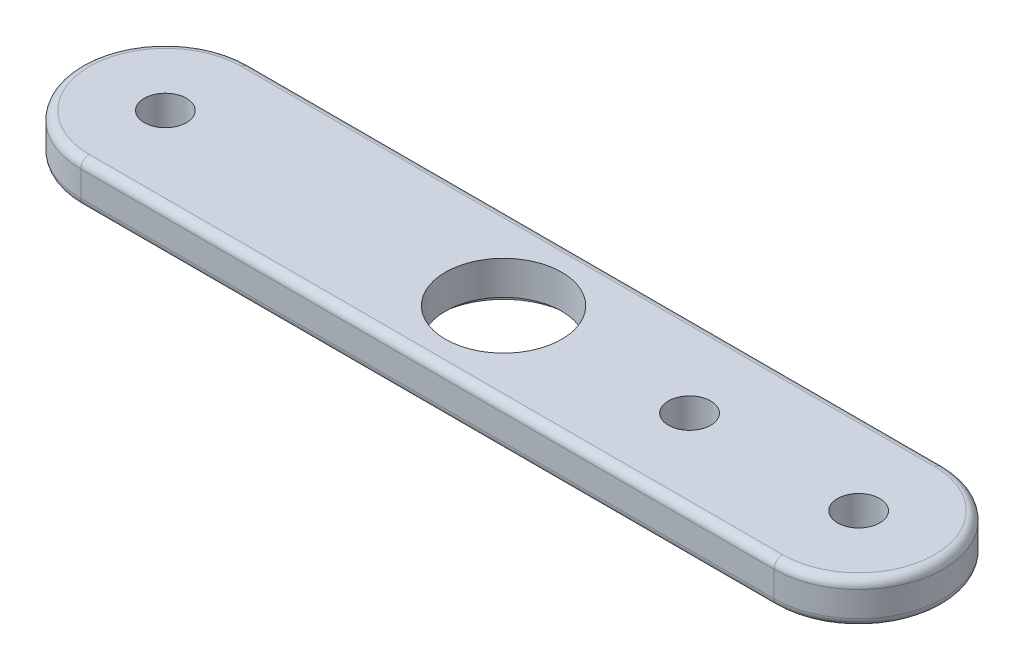
ISO-10303-21;
HEADER;
FILE_DESCRIPTION(('STEP AP214'),'2;1');
FILE_NAME('part.step','',(''),(''),'','','');
FILE_SCHEMA(('AUTOMOTIVE_DESIGN { 1 0 10303 214 1 1 1 1 }'));
ENDSEC;
DATA;
#1=APPLICATION_CONTEXT('core data for automotive mechanical design processes');
#2=APPLICATION_PROTOCOL_DEFINITION('international standard','automotive_design',2000,#1);
#3=PRODUCT_CONTEXT('',#1,'mechanical');
#4=PRODUCT('Part','Part','',(#3));
#5=PRODUCT_RELATED_PRODUCT_CATEGORY('part','',(#4));
#6=PRODUCT_DEFINITION_FORMATION('','',#4);
#7=PRODUCT_DEFINITION_CONTEXT('part definition',#1,'design');
#8=PRODUCT_DEFINITION('design','',#6,#7);
#9=PRODUCT_DEFINITION_SHAPE('','',#8);
#10=(LENGTH_UNIT() NAMED_UNIT(*) SI_UNIT(.MILLI.,.METRE.));
#11=(NAMED_UNIT(*) PLANE_ANGLE_UNIT() SI_UNIT($,.RADIAN.));
#12=(NAMED_UNIT(*) SI_UNIT($,.STERADIAN.) SOLID_ANGLE_UNIT());
#13=UNCERTAINTY_MEASURE_WITH_UNIT(LENGTH_MEASURE(1.E-05),#10,'distance_accuracy_value','');
#14=(GEOMETRIC_REPRESENTATION_CONTEXT(3) GLOBAL_UNCERTAINTY_ASSIGNED_CONTEXT((#13)) GLOBAL_UNIT_ASSIGNED_CONTEXT((#10,
#11,#12)) REPRESENTATION_CONTEXT('',''));
#15=CARTESIAN_POINT('',(0.,0.,0.));
#16=DIRECTION('',(0.,0.,1.));
#17=DIRECTION('',(1.,0.,0.));
#18=AXIS2_PLACEMENT_3D('',#15,#16,#17);
#19=CARTESIAN_POINT('',(0.,6.35,0.));
#20=DIRECTION('',(0.,1.,0.));
#21=DIRECTION('',(0.,0.,1.));
#22=AXIS2_PLACEMENT_3D('',#19,#20,#21);
#23=PLANE('',#22);
#24=CARTESIAN_POINT('',(52.07,6.35,0.));
#25=DIRECTION('',(0.,1.,0.));
#26=DIRECTION('',(0.,0.,1.));
#27=AXIS2_PLACEMENT_3D('',#24,#25,#26);
#28=CIRCLE('',#27,11.43);
#29=CARTESIAN_POINT('',(52.07,6.35,11.43));
#30=VERTEX_POINT('',#29);
#31=CARTESIAN_POINT('',(52.07,6.35,-11.43));
#32=VERTEX_POINT('',#31);
#33=EDGE_CURVE('E62',#30,#32,#28,.T.);
#34=ORIENTED_EDGE('',*,*,#33,.T.);
#35=DIRECTION('',(-1.,0.,0.));
#36=VECTOR('',#35,1.);
#37=CARTESIAN_POINT('',(-52.07,6.35,-11.43));
#38=LINE('',#37,#36);
#39=CARTESIAN_POINT('',(-52.07,6.35,-11.43));
#40=VERTEX_POINT('',#39);
#41=EDGE_CURVE('E57',#32,#40,#38,.T.);
#42=ORIENTED_EDGE('',*,*,#41,.T.);
#43=CARTESIAN_POINT('',(-52.07,6.35,0.));
#44=DIRECTION('',(0.,1.,0.));
#45=DIRECTION('',(0.,0.,1.));
#46=AXIS2_PLACEMENT_3D('',#43,#44,#45);
#47=CIRCLE('',#46,11.43);
#48=CARTESIAN_POINT('',(-52.07,6.35,11.43));
#49=VERTEX_POINT('',#48);
#50=EDGE_CURVE('E176',#40,#49,#47,.T.);
#51=ORIENTED_EDGE('',*,*,#50,.T.);
#52=DIRECTION('',(1.,0.,0.));
#53=VECTOR('',#52,1.);
#54=CARTESIAN_POINT('',(52.07,6.35,11.43));
#55=LINE('',#54,#53);
#56=EDGE_CURVE('E171',#49,#30,#55,.T.);
#57=ORIENTED_EDGE('',*,*,#56,.T.);
#58=EDGE_LOOP('',(#34,#42,#51,#57));
#59=FACE_BOUND('',#58,.T.);
#60=CARTESIAN_POINT('',(-52.07,6.35,0.));
#61=DIRECTION('',(0.,1.,0.));
#62=DIRECTION('',(0.,0.,1.));
#63=AXIS2_PLACEMENT_3D('',#60,#61,#62);
#64=CIRCLE('',#63,3.175);
#65=CARTESIAN_POINT('',(-52.07,6.35,3.175));
#66=VERTEX_POINT('',#65);
#67=EDGE_CURVE('E239',#66,#66,#64,.T.);
#68=ORIENTED_EDGE('',*,*,#67,.F.);
#69=EDGE_LOOP('',(#68));
#70=FACE_BOUND('',#69,.T.);
#71=CARTESIAN_POINT('',(26.67,6.35,0.));
#72=DIRECTION('',(0.,1.,0.));
#73=DIRECTION('',(0.,0.,1.));
#74=AXIS2_PLACEMENT_3D('',#71,#72,#73);
#75=CIRCLE('',#74,3.175);
#76=CARTESIAN_POINT('',(26.67,6.35,3.175));
#77=VERTEX_POINT('',#76);
#78=EDGE_CURVE('E247',#77,#77,#75,.T.);
#79=ORIENTED_EDGE('',*,*,#78,.F.);
#80=EDGE_LOOP('',(#79));
#81=FACE_BOUND('',#80,.T.);
#82=CARTESIAN_POINT('',(52.07,6.35,0.));
#83=DIRECTION('',(0.,1.,0.));
#84=DIRECTION('',(0.,0.,1.));
#85=AXIS2_PLACEMENT_3D('',#82,#83,#84);
#86=CIRCLE('',#85,3.17500000000001);
#87=CARTESIAN_POINT('',(52.07,6.35,3.17500000000001));
#88=VERTEX_POINT('',#87);
#89=EDGE_CURVE('E255',#88,#88,#86,.T.);
#90=ORIENTED_EDGE('',*,*,#89,.F.);
#91=EDGE_LOOP('',(#90));
#92=FACE_BOUND('',#91,.T.);
#93=CARTESIAN_POINT('',(-1.26999999999999,6.35,0.));
#94=DIRECTION('',(0.,1.,0.));
#95=DIRECTION('',(0.,0.,1.));
#96=AXIS2_PLACEMENT_3D('',#93,#94,#95);
#97=CIRCLE('',#96,8.73125);
#98=CARTESIAN_POINT('',(-1.26999999999999,6.35,8.73125));
#99=VERTEX_POINT('',#98);
#100=EDGE_CURVE('E259',#99,#99,#97,.T.);
#101=ORIENTED_EDGE('',*,*,#100,.F.);
#102=EDGE_LOOP('',(#101));
#103=FACE_BOUND('',#102,.T.);
#104=ADVANCED_FACE('F39',(#59,#70,#81,#92,#103),#23,.T.);
#105=CARTESIAN_POINT('',(0.,0.,0.));
#106=DIRECTION('',(0.,1.,0.));
#107=DIRECTION('',(0.,0.,1.));
#108=AXIS2_PLACEMENT_3D('',#105,#106,#107);
#109=PLANE('',#108);
#110=CARTESIAN_POINT('',(-52.07,0.,0.));
#111=DIRECTION('',(0.,1.,0.));
#112=DIRECTION('',(0.,0.,1.));
#113=AXIS2_PLACEMENT_3D('',#110,#111,#112);
#114=CIRCLE('',#113,11.43);
#115=CARTESIAN_POINT('',(-52.07,0.,11.43));
#116=VERTEX_POINT('',#115);
#117=CARTESIAN_POINT('',(-52.07,0.,-11.43));
#118=VERTEX_POINT('',#117);
#119=EDGE_CURVE('E160',#116,#118,#114,.F.);
#120=ORIENTED_EDGE('',*,*,#119,.T.);
#121=DIRECTION('',(-1.,0.,0.));
#122=VECTOR('',#121,1.);
#123=CARTESIAN_POINT('',(0.,0.,-11.43));
#124=LINE('',#123,#122);
#125=CARTESIAN_POINT('',(52.07,0.,-11.43));
#126=VERTEX_POINT('',#125);
#127=EDGE_CURVE('E136',#118,#126,#124,.F.);
#128=ORIENTED_EDGE('',*,*,#127,.T.);
#129=CARTESIAN_POINT('',(52.07,0.,0.));
#130=DIRECTION('',(0.,1.,0.));
#131=DIRECTION('',(0.,0.,1.));
#132=AXIS2_PLACEMENT_3D('',#129,#130,#131);
#133=CIRCLE('',#132,11.43);
#134=CARTESIAN_POINT('',(52.07,0.,11.43));
#135=VERTEX_POINT('',#134);
#136=EDGE_CURVE('E152',#126,#135,#133,.F.);
#137=ORIENTED_EDGE('',*,*,#136,.T.);
#138=DIRECTION('',(1.,0.,0.));
#139=VECTOR('',#138,1.);
#140=CARTESIAN_POINT('',(0.,0.,11.43));
#141=LINE('',#140,#139);
#142=EDGE_CURVE('E148',#135,#116,#141,.F.);
#143=ORIENTED_EDGE('',*,*,#142,.T.);
#144=EDGE_LOOP('',(#120,#128,#137,#143));
#145=FACE_BOUND('',#144,.T.);
#146=CARTESIAN_POINT('',(-1.26999999999999,0.,0.));
#147=DIRECTION('',(0.,-1.,0.));
#148=DIRECTION('',(0.,0.,-1.));
#149=AXIS2_PLACEMENT_3D('',#146,#147,#148);
#150=CIRCLE('',#149,10.16);
#151=CARTESIAN_POINT('',(-1.26999999999999,0.,-10.16));
#152=VERTEX_POINT('',#151);
#153=EDGE_CURVE('E131',#152,#152,#150,.T.);
#154=ORIENTED_EDGE('',*,*,#153,.F.);
#155=EDGE_LOOP('',(#154));
#156=FACE_BOUND('',#155,.T.);
#157=CARTESIAN_POINT('',(-52.07,0.,0.));
#158=DIRECTION('',(0.,1.,0.));
#159=DIRECTION('',(0.,0.,1.));
#160=AXIS2_PLACEMENT_3D('',#157,#158,#159);
#161=CIRCLE('',#160,3.175);
#162=CARTESIAN_POINT('',(-52.07,0.,3.175));
#163=VERTEX_POINT('',#162);
#164=EDGE_CURVE('E154',#163,#163,#161,.T.);
#165=ORIENTED_EDGE('',*,*,#164,.T.);
#166=EDGE_LOOP('',(#165));
#167=FACE_BOUND('',#166,.T.);
#168=CARTESIAN_POINT('',(26.67,0.,0.));
#169=DIRECTION('',(0.,1.,0.));
#170=DIRECTION('',(0.,0.,1.));
#171=AXIS2_PLACEMENT_3D('',#168,#169,#170);
#172=CIRCLE('',#171,3.175);
#173=CARTESIAN_POINT('',(26.67,0.,3.175));
#174=VERTEX_POINT('',#173);
#175=EDGE_CURVE('E243',#174,#174,#172,.T.);
#176=ORIENTED_EDGE('',*,*,#175,.T.);
#177=EDGE_LOOP('',(#176));
#178=FACE_BOUND('',#177,.T.);
#179=CARTESIAN_POINT('',(52.07,0.,0.));
#180=DIRECTION('',(0.,1.,0.));
#181=DIRECTION('',(0.,0.,1.));
#182=AXIS2_PLACEMENT_3D('',#179,#180,#181);
#183=CIRCLE('',#182,3.17500000000001);
#184=CARTESIAN_POINT('',(52.07,0.,3.17500000000001));
#185=VERTEX_POINT('',#184);
#186=EDGE_CURVE('E251',#185,#185,#183,.T.);
#187=ORIENTED_EDGE('',*,*,#186,.T.);
#188=EDGE_LOOP('',(#187));
#189=FACE_BOUND('',#188,.T.);
#190=ADVANCED_FACE('F283',(#145,#156,#167,#178,#189),#109,.F.);
#191=CARTESIAN_POINT('',(64.77,6.35,12.7));
#192=DIRECTION('',(0.,0.,-1.));
#193=DIRECTION('',(-1.,0.,0.));
#194=AXIS2_PLACEMENT_3D('',#191,#192,#193);
#195=PLANE('',#194);
#196=DIRECTION('',(0.,1.,0.));
#197=VECTOR('',#196,1.);
#198=CARTESIAN_POINT('',(-52.07,0.,12.7));
#199=LINE('',#198,#197);
#200=CARTESIAN_POINT('',(-52.07,1.27,12.7));
#201=VERTEX_POINT('',#200);
#202=CARTESIAN_POINT('',(-52.07,5.08,12.7));
#203=VERTEX_POINT('',#202);
#204=EDGE_CURVE('E221',#201,#203,#199,.T.);
#205=ORIENTED_EDGE('',*,*,#204,.F.);
#206=DIRECTION('',(1.,0.,0.));
#207=VECTOR('',#206,1.);
#208=CARTESIAN_POINT('',(64.77,1.27,12.7));
#209=LINE('',#208,#207);
#210=CARTESIAN_POINT('',(52.07,1.27,12.7));
#211=VERTEX_POINT('',#210);
#212=EDGE_CURVE('E11',#201,#211,#209,.T.);
#213=ORIENTED_EDGE('',*,*,#212,.T.);
#214=DIRECTION('',(0.,1.,0.));
#215=VECTOR('',#214,1.);
#216=CARTESIAN_POINT('',(52.07,0.,12.7));
#217=LINE('',#216,#215);
#218=CARTESIAN_POINT('',(52.07,5.08,12.7));
#219=VERTEX_POINT('',#218);
#220=EDGE_CURVE('E193',#211,#219,#217,.T.);
#221=ORIENTED_EDGE('',*,*,#220,.T.);
#222=DIRECTION('',(1.,0.,0.));
#223=VECTOR('',#222,1.);
#224=CARTESIAN_POINT('',(-52.07,5.08,12.7));
#225=LINE('',#224,#223);
#226=EDGE_CURVE('E49',#219,#203,#225,.F.);
#227=ORIENTED_EDGE('',*,*,#226,.T.);
#228=EDGE_LOOP('',(#205,#213,#221,#227));
#229=FACE_BOUND('',#228,.T.);
#230=ADVANCED_FACE('F219',(#229),#195,.F.);
#231=CARTESIAN_POINT('',(64.77,6.35,-12.7));
#232=DIRECTION('',(0.,0.,1.));
#233=DIRECTION('',(1.,0.,0.));
#234=AXIS2_PLACEMENT_3D('',#231,#232,#233);
#235=PLANE('',#234);
#236=DIRECTION('',(0.,1.,0.));
#237=VECTOR('',#236,1.);
#238=CARTESIAN_POINT('',(52.07,0.,-12.7));
#239=LINE('',#238,#237);
#240=CARTESIAN_POINT('',(52.07,1.27,-12.7));
#241=VERTEX_POINT('',#240);
#242=CARTESIAN_POINT('',(52.07,5.08,-12.7));
#243=VERTEX_POINT('',#242);
#244=EDGE_CURVE('E112',#241,#243,#239,.T.);
#245=ORIENTED_EDGE('',*,*,#244,.F.);
#246=DIRECTION('',(-1.,0.,0.));
#247=VECTOR('',#246,1.);
#248=CARTESIAN_POINT('',(64.77,1.27,-12.7));
#249=LINE('',#248,#247);
#250=CARTESIAN_POINT('',(-52.07,1.27,-12.7));
#251=VERTEX_POINT('',#250);
#252=EDGE_CURVE('E107',#241,#251,#249,.T.);
#253=ORIENTED_EDGE('',*,*,#252,.T.);
#254=DIRECTION('',(0.,1.,0.));
#255=VECTOR('',#254,1.);
#256=CARTESIAN_POINT('',(-52.07,0.,-12.7));
#257=LINE('',#256,#255);
#258=CARTESIAN_POINT('',(-52.07,5.08,-12.7));
#259=VERTEX_POINT('',#258);
#260=EDGE_CURVE('E110',#251,#259,#257,.T.);
#261=ORIENTED_EDGE('',*,*,#260,.T.);
#262=DIRECTION('',(-1.,0.,0.));
#263=VECTOR('',#262,1.);
#264=CARTESIAN_POINT('',(52.07,5.08,-12.7));
#265=LINE('',#264,#263);
#266=EDGE_CURVE('E118',#259,#243,#265,.F.);
#267=ORIENTED_EDGE('',*,*,#266,.T.);
#268=EDGE_LOOP('',(#245,#253,#261,#267));
#269=FACE_BOUND('',#268,.T.);
#270=ADVANCED_FACE('F109',(#269),#235,.F.);
#271=CARTESIAN_POINT('',(-1.26999999999999,0.,0.));
#272=DIRECTION('',(0.,1.,0.));
#273=DIRECTION('',(0.,0.,1.));
#274=AXIS2_PLACEMENT_3D('',#271,#272,#273);
#275=CYLINDRICAL_SURFACE('',#274,8.73125);
#276=ORIENTED_EDGE('',*,*,#100,.T.);
#277=EDGE_LOOP('',(#276));
#278=FACE_BOUND('',#277,.T.);
#279=CARTESIAN_POINT('',(-1.26999999999999,1.27,0.));
#280=DIRECTION('',(0.,-1.,0.));
#281=DIRECTION('',(0.,0.,-1.));
#282=AXIS2_PLACEMENT_3D('',#279,#280,#281);
#283=CIRCLE('',#282,8.73125);
#284=CARTESIAN_POINT('',(-1.26999999999999,1.27,-8.73125));
#285=VERTEX_POINT('',#284);
#286=EDGE_CURVE('E232',#285,#285,#283,.F.);
#287=ORIENTED_EDGE('',*,*,#286,.F.);
#288=EDGE_LOOP('',(#287));
#289=FACE_BOUND('',#288,.T.);
#290=ADVANCED_FACE('F268',(#278,#289),#275,.F.);
#291=CARTESIAN_POINT('',(52.07,0.,0.));
#292=DIRECTION('',(0.,1.,0.));
#293=DIRECTION('',(0.,0.,1.));
#294=AXIS2_PLACEMENT_3D('',#291,#292,#293);
#295=CYLINDRICAL_SURFACE('',#294,3.17500000000001);
#296=ORIENTED_EDGE('',*,*,#186,.F.);
#297=EDGE_LOOP('',(#296));
#298=FACE_BOUND('',#297,.T.);
#299=ORIENTED_EDGE('',*,*,#89,.T.);
#300=EDGE_LOOP('',(#299));
#301=FACE_BOUND('',#300,.T.);
#302=ADVANCED_FACE('F270',(#298,#301),#295,.F.);
#303=CARTESIAN_POINT('',(26.67,0.,0.));
#304=DIRECTION('',(0.,1.,0.));
#305=DIRECTION('',(0.,0.,1.));
#306=AXIS2_PLACEMENT_3D('',#303,#304,#305);
#307=CYLINDRICAL_SURFACE('',#306,3.175);
#308=ORIENTED_EDGE('',*,*,#175,.F.);
#309=EDGE_LOOP('',(#308));
#310=FACE_BOUND('',#309,.T.);
#311=ORIENTED_EDGE('',*,*,#78,.T.);
#312=EDGE_LOOP('',(#311));
#313=FACE_BOUND('',#312,.T.);
#314=ADVANCED_FACE('F277',(#310,#313),#307,.F.);
#315=CARTESIAN_POINT('',(-52.07,0.,0.));
#316=DIRECTION('',(0.,1.,0.));
#317=DIRECTION('',(0.,0.,1.));
#318=AXIS2_PLACEMENT_3D('',#315,#316,#317);
#319=CYLINDRICAL_SURFACE('',#318,3.175);
#320=ORIENTED_EDGE('',*,*,#164,.F.);
#321=EDGE_LOOP('',(#320));
#322=FACE_BOUND('',#321,.T.);
#323=ORIENTED_EDGE('',*,*,#67,.T.);
#324=EDGE_LOOP('',(#323));
#325=FACE_BOUND('',#324,.T.);
#326=ADVANCED_FACE('F360',(#322,#325),#319,.F.);
#327=CARTESIAN_POINT('',(-1.26999999999999,1.27,0.));
#328=DIRECTION('',(0.,-1.,0.));
#329=DIRECTION('',(0.,0.,-1.));
#330=AXIS2_PLACEMENT_3D('',#327,#328,#329);
#331=PLANE('',#330);
#332=CARTESIAN_POINT('',(-1.26999999999999,1.27,0.));
#333=DIRECTION('',(0.,-1.,0.));
#334=DIRECTION('',(0.,0.,-1.));
#335=AXIS2_PLACEMENT_3D('',#332,#333,#334);
#336=CIRCLE('',#335,10.16);
#337=CARTESIAN_POINT('',(-1.26999999999999,1.27,-10.16));
#338=VERTEX_POINT('',#337);
#339=EDGE_CURVE('E228',#338,#338,#336,.T.);
#340=ORIENTED_EDGE('',*,*,#339,.T.);
#341=EDGE_LOOP('',(#340));
#342=FACE_BOUND('',#341,.T.);
#343=ORIENTED_EDGE('',*,*,#286,.T.);
#344=EDGE_LOOP('',(#343));
#345=FACE_BOUND('',#344,.T.);
#346=ADVANCED_FACE('F266',(#342,#345),#331,.T.);
#347=CARTESIAN_POINT('',(-1.26999999999999,1.27,0.));
#348=DIRECTION('',(0.,-1.,0.));
#349=DIRECTION('',(0.,0.,-1.));
#350=AXIS2_PLACEMENT_3D('',#347,#348,#349);
#351=CYLINDRICAL_SURFACE('',#350,10.16);
#352=ORIENTED_EDGE('',*,*,#339,.F.);
#353=EDGE_LOOP('',(#352));
#354=FACE_BOUND('',#353,.T.);
#355=ORIENTED_EDGE('',*,*,#153,.T.);
#356=EDGE_LOOP('',(#355));
#357=FACE_BOUND('',#356,.T.);
#358=ADVANCED_FACE('F345',(#354,#357),#351,.F.);
#359=CARTESIAN_POINT('',(52.07,0.,0.));
#360=DIRECTION('',(0.,1.,0.));
#361=DIRECTION('',(0.,0.,1.));
#362=AXIS2_PLACEMENT_3D('',#359,#360,#361);
#363=CYLINDRICAL_SURFACE('',#362,12.7);
#364=ORIENTED_EDGE('',*,*,#220,.F.);
#365=CARTESIAN_POINT('',(52.07,1.27,0.));
#366=DIRECTION('',(0.,1.,0.));
#367=DIRECTION('',(0.,0.,1.));
#368=AXIS2_PLACEMENT_3D('',#365,#366,#367);
#369=CIRCLE('',#368,12.7);
#370=EDGE_CURVE('E168',#211,#241,#369,.T.);
#371=ORIENTED_EDGE('',*,*,#370,.T.);
#372=ORIENTED_EDGE('',*,*,#244,.T.);
#373=CARTESIAN_POINT('',(52.07,5.08,0.));
#374=DIRECTION('',(0.,1.,0.));
#375=DIRECTION('',(0.,0.,1.));
#376=AXIS2_PLACEMENT_3D('',#373,#374,#375);
#377=CIRCLE('',#376,12.7);
#378=EDGE_CURVE('E165',#243,#219,#377,.F.);
#379=ORIENTED_EDGE('',*,*,#378,.T.);
#380=EDGE_LOOP('',(#364,#371,#372,#379));
#381=FACE_BOUND('',#380,.T.);
#382=ADVANCED_FACE('F216',(#381),#363,.T.);
#383=CARTESIAN_POINT('',(-52.07,0.,0.));
#384=DIRECTION('',(0.,1.,0.));
#385=DIRECTION('',(0.,0.,1.));
#386=AXIS2_PLACEMENT_3D('',#383,#384,#385);
#387=CYLINDRICAL_SURFACE('',#386,12.7);
#388=ORIENTED_EDGE('',*,*,#260,.F.);
#389=CARTESIAN_POINT('',(-52.07,1.27,0.));
#390=DIRECTION('',(0.,1.,0.));
#391=DIRECTION('',(0.,0.,1.));
#392=AXIS2_PLACEMENT_3D('',#389,#390,#391);
#393=CIRCLE('',#392,12.7);
#394=EDGE_CURVE('E126',#251,#201,#393,.T.);
#395=ORIENTED_EDGE('',*,*,#394,.T.);
#396=ORIENTED_EDGE('',*,*,#204,.T.);
#397=CARTESIAN_POINT('',(-52.07,5.08,0.));
#398=DIRECTION('',(0.,1.,0.));
#399=DIRECTION('',(0.,0.,1.));
#400=AXIS2_PLACEMENT_3D('',#397,#398,#399);
#401=CIRCLE('',#400,12.7);
#402=EDGE_CURVE('E129',#203,#259,#401,.F.);
#403=ORIENTED_EDGE('',*,*,#402,.T.);
#404=EDGE_LOOP('',(#388,#395,#396,#403));
#405=FACE_BOUND('',#404,.T.);
#406=ADVANCED_FACE('F123',(#405),#387,.T.);
#407=CARTESIAN_POINT('',(52.07,1.27,0.));
#408=DIRECTION('',(0.,1.,0.));
#409=DIRECTION('',(0.,0.,1.));
#410=AXIS2_PLACEMENT_3D('',#407,#408,#409);
#411=TOROIDAL_SURFACE('',#410,11.43,1.27);
#412=CARTESIAN_POINT('',(52.07,1.27,11.43));
#413=DIRECTION('',(-1.,0.,0.));
#414=DIRECTION('',(0.,0.,1.));
#415=AXIS2_PLACEMENT_3D('',#412,#413,#414);
#416=CIRCLE('',#415,1.27);
#417=EDGE_CURVE('E141',#135,#211,#416,.T.);
#418=ORIENTED_EDGE('',*,*,#417,.F.);
#419=ORIENTED_EDGE('',*,*,#136,.F.);
#420=CARTESIAN_POINT('',(52.07,1.27,-11.43));
#421=DIRECTION('',(-1.,0.,0.));
#422=DIRECTION('',(0.,0.,1.));
#423=AXIS2_PLACEMENT_3D('',#420,#421,#422);
#424=CIRCLE('',#423,1.27);
#425=EDGE_CURVE('E190',#241,#126,#424,.T.);
#426=ORIENTED_EDGE('',*,*,#425,.F.);
#427=ORIENTED_EDGE('',*,*,#370,.F.);
#428=EDGE_LOOP('',(#418,#419,#426,#427));
#429=FACE_BOUND('',#428,.T.);
#430=ADVANCED_FACE('F301',(#429),#411,.T.);
#431=CARTESIAN_POINT('',(64.77,1.27,-11.43));
#432=DIRECTION('',(-1.,0.,0.));
#433=DIRECTION('',(0.,0.,1.));
#434=AXIS2_PLACEMENT_3D('',#431,#432,#433);
#435=CYLINDRICAL_SURFACE('',#434,1.27);
#436=ORIENTED_EDGE('',*,*,#425,.T.);
#437=ORIENTED_EDGE('',*,*,#127,.F.);
#438=CARTESIAN_POINT('',(-52.07,1.27,-11.43));
#439=DIRECTION('',(-1.,0.,0.));
#440=DIRECTION('',(0.,0.,1.));
#441=AXIS2_PLACEMENT_3D('',#438,#439,#440);
#442=CIRCLE('',#441,1.27);
#443=EDGE_CURVE('E134',#251,#118,#442,.T.);
#444=ORIENTED_EDGE('',*,*,#443,.F.);
#445=ORIENTED_EDGE('',*,*,#252,.F.);
#446=EDGE_LOOP('',(#436,#437,#444,#445));
#447=FACE_BOUND('',#446,.T.);
#448=ADVANCED_FACE('F135',(#447),#435,.T.);
#449=CARTESIAN_POINT('',(64.77,1.27,11.43));
#450=DIRECTION('',(1.,0.,0.));
#451=DIRECTION('',(0.,0.,-1.));
#452=AXIS2_PLACEMENT_3D('',#449,#450,#451);
#453=CYLINDRICAL_SURFACE('',#452,1.27);
#454=ORIENTED_EDGE('',*,*,#417,.T.);
#455=ORIENTED_EDGE('',*,*,#212,.F.);
#456=CARTESIAN_POINT('',(-52.07,1.27,11.43));
#457=DIRECTION('',(-1.,0.,0.));
#458=DIRECTION('',(0.,0.,1.));
#459=AXIS2_PLACEMENT_3D('',#456,#457,#458);
#460=CIRCLE('',#459,1.27);
#461=EDGE_CURVE('E142',#116,#201,#460,.T.);
#462=ORIENTED_EDGE('',*,*,#461,.F.);
#463=ORIENTED_EDGE('',*,*,#142,.F.);
#464=EDGE_LOOP('',(#454,#455,#462,#463));
#465=FACE_BOUND('',#464,.T.);
#466=ADVANCED_FACE('F295',(#465),#453,.T.);
#467=CARTESIAN_POINT('',(-52.07,1.27,0.));
#468=DIRECTION('',(0.,1.,0.));
#469=DIRECTION('',(0.,0.,1.));
#470=AXIS2_PLACEMENT_3D('',#467,#468,#469);
#471=TOROIDAL_SURFACE('',#470,11.43,1.27);
#472=ORIENTED_EDGE('',*,*,#443,.T.);
#473=ORIENTED_EDGE('',*,*,#119,.F.);
#474=ORIENTED_EDGE('',*,*,#461,.T.);
#475=ORIENTED_EDGE('',*,*,#394,.F.);
#476=EDGE_LOOP('',(#472,#473,#474,#475));
#477=FACE_BOUND('',#476,.T.);
#478=ADVANCED_FACE('F144',(#477),#471,.T.);
#479=CARTESIAN_POINT('',(52.07,5.08,0.));
#480=DIRECTION('',(0.,1.,0.));
#481=DIRECTION('',(0.,0.,1.));
#482=AXIS2_PLACEMENT_3D('',#479,#480,#481);
#483=TOROIDAL_SURFACE('',#482,11.43,1.27);
#484=CARTESIAN_POINT('',(52.07,5.08,11.43));
#485=DIRECTION('',(-1.,0.,0.));
#486=DIRECTION('',(0.,0.,1.));
#487=AXIS2_PLACEMENT_3D('',#484,#485,#486);
#488=CIRCLE('',#487,1.27);
#489=EDGE_CURVE('E199',#219,#30,#488,.T.);
#490=ORIENTED_EDGE('',*,*,#489,.F.);
#491=ORIENTED_EDGE('',*,*,#378,.F.);
#492=CARTESIAN_POINT('',(52.07,5.08,-11.43));
#493=DIRECTION('',(-1.,0.,0.));
#494=DIRECTION('',(0.,0.,1.));
#495=AXIS2_PLACEMENT_3D('',#492,#493,#494);
#496=CIRCLE('',#495,1.27);
#497=EDGE_CURVE('E43',#32,#243,#496,.T.);
#498=ORIENTED_EDGE('',*,*,#497,.F.);
#499=ORIENTED_EDGE('',*,*,#33,.F.);
#500=EDGE_LOOP('',(#490,#491,#498,#499));
#501=FACE_BOUND('',#500,.T.);
#502=ADVANCED_FACE('F41',(#501),#483,.T.);
#503=CARTESIAN_POINT('',(0.,5.08,-11.43));
#504=DIRECTION('',(1.,0.,0.));
#505=DIRECTION('',(0.,0.,-1.));
#506=AXIS2_PLACEMENT_3D('',#503,#504,#505);
#507=CYLINDRICAL_SURFACE('',#506,1.27);
#508=ORIENTED_EDGE('',*,*,#497,.T.);
#509=ORIENTED_EDGE('',*,*,#266,.F.);
#510=CARTESIAN_POINT('',(-52.07,5.08,-11.43));
#511=DIRECTION('',(-1.,0.,0.));
#512=DIRECTION('',(0.,0.,1.));
#513=AXIS2_PLACEMENT_3D('',#510,#511,#512);
#514=CIRCLE('',#513,1.27);
#515=EDGE_CURVE('E197',#40,#259,#514,.T.);
#516=ORIENTED_EDGE('',*,*,#515,.F.);
#517=ORIENTED_EDGE('',*,*,#41,.F.);
#518=EDGE_LOOP('',(#508,#509,#516,#517));
#519=FACE_BOUND('',#518,.T.);
#520=ADVANCED_FACE('F210',(#519),#507,.T.);
#521=CARTESIAN_POINT('',(0.,5.08,11.43));
#522=DIRECTION('',(-1.,0.,0.));
#523=DIRECTION('',(0.,0.,1.));
#524=AXIS2_PLACEMENT_3D('',#521,#522,#523);
#525=CYLINDRICAL_SURFACE('',#524,1.27);
#526=ORIENTED_EDGE('',*,*,#489,.T.);
#527=ORIENTED_EDGE('',*,*,#56,.F.);
#528=CARTESIAN_POINT('',(-52.07,5.08,11.43));
#529=DIRECTION('',(-1.,0.,0.));
#530=DIRECTION('',(0.,0.,1.));
#531=AXIS2_PLACEMENT_3D('',#528,#529,#530);
#532=CIRCLE('',#531,1.27);
#533=EDGE_CURVE('E194',#203,#49,#532,.T.);
#534=ORIENTED_EDGE('',*,*,#533,.F.);
#535=ORIENTED_EDGE('',*,*,#226,.F.);
#536=EDGE_LOOP('',(#526,#527,#534,#535));
#537=FACE_BOUND('',#536,.T.);
#538=ADVANCED_FACE('F308',(#537),#525,.T.);
#539=CARTESIAN_POINT('',(-52.07,5.08,0.));
#540=DIRECTION('',(0.,1.,0.));
#541=DIRECTION('',(0.,0.,1.));
#542=AXIS2_PLACEMENT_3D('',#539,#540,#541);
#543=TOROIDAL_SURFACE('',#542,11.43,1.27);
#544=ORIENTED_EDGE('',*,*,#515,.T.);
#545=ORIENTED_EDGE('',*,*,#402,.F.);
#546=ORIENTED_EDGE('',*,*,#533,.T.);
#547=ORIENTED_EDGE('',*,*,#50,.F.);
#548=EDGE_LOOP('',(#544,#545,#546,#547));
#549=FACE_BOUND('',#548,.T.);
#550=ADVANCED_FACE('F305',(#549),#543,.T.);
#551=CLOSED_SHELL('',(#104,#190,#230,#270,#290,#302,#314,#326,#346,#358,#382,#406,#430,#448,
#466,#478,#502,#520,#538,#550));
#552=MANIFOLD_SOLID_BREP('B2',#551);
#553=ADVANCED_BREP_SHAPE_REPRESENTATION('',(#18,#552),#14);
#554=SHAPE_DEFINITION_REPRESENTATION(#9,#553);
ENDSEC;
END-ISO-10303-21;
